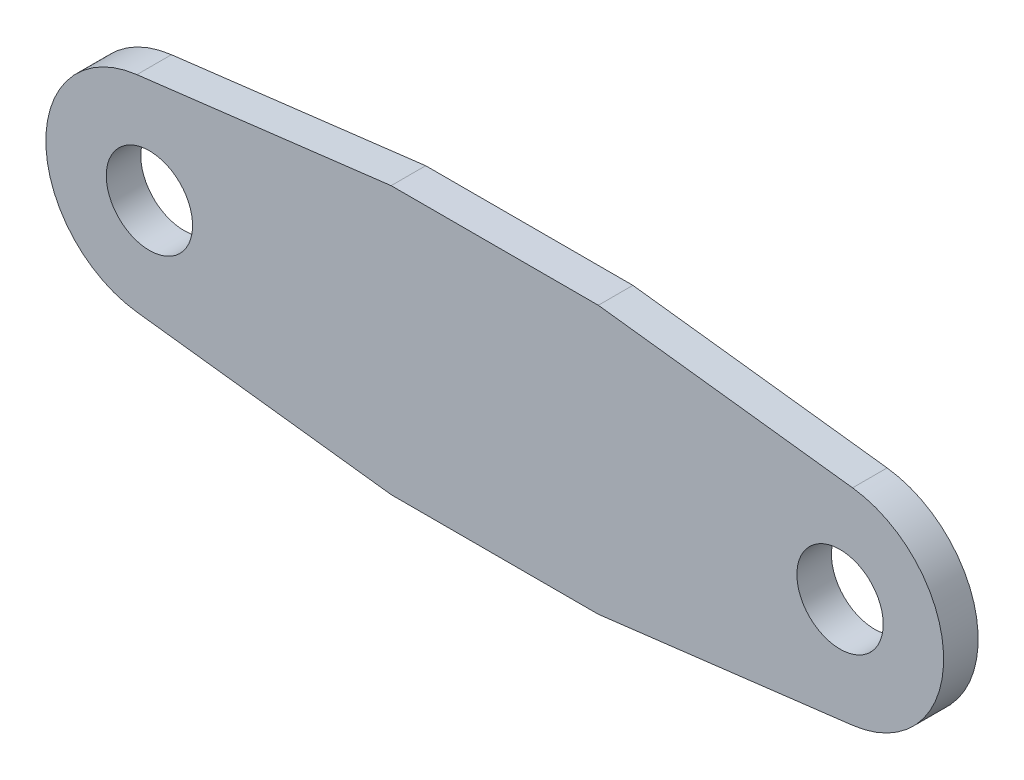
ISO-10303-21;
HEADER;
FILE_DESCRIPTION(('STEP AP214'),'2;1');
FILE_NAME('part.step','',(''),(''),'','','');
FILE_SCHEMA(('AUTOMOTIVE_DESIGN { 1 0 10303 214 1 1 1 1 }'));
ENDSEC;
DATA;
#1=APPLICATION_CONTEXT('core data for automotive mechanical design processes');
#2=APPLICATION_PROTOCOL_DEFINITION('international standard','automotive_design',2000,#1);
#3=PRODUCT_CONTEXT('',#1,'mechanical');
#4=PRODUCT('Part','Part','',(#3));
#5=PRODUCT_RELATED_PRODUCT_CATEGORY('part','',(#4));
#6=PRODUCT_DEFINITION_FORMATION('','',#4);
#7=PRODUCT_DEFINITION_CONTEXT('part definition',#1,'design');
#8=PRODUCT_DEFINITION('design','',#6,#7);
#9=PRODUCT_DEFINITION_SHAPE('','',#8);
#10=(LENGTH_UNIT() NAMED_UNIT(*) SI_UNIT(.MILLI.,.METRE.));
#11=(NAMED_UNIT(*) PLANE_ANGLE_UNIT() SI_UNIT($,.RADIAN.));
#12=(NAMED_UNIT(*) SI_UNIT($,.STERADIAN.) SOLID_ANGLE_UNIT());
#13=UNCERTAINTY_MEASURE_WITH_UNIT(LENGTH_MEASURE(1.E-05),#10,'distance_accuracy_value','');
#14=(GEOMETRIC_REPRESENTATION_CONTEXT(3) GLOBAL_UNCERTAINTY_ASSIGNED_CONTEXT((#13)) GLOBAL_UNIT_ASSIGNED_CONTEXT((#10,
#11,#12)) REPRESENTATION_CONTEXT('',''));
#15=CARTESIAN_POINT('',(0.,0.,0.));
#16=DIRECTION('',(0.,0.,1.));
#17=DIRECTION('',(1.,0.,0.));
#18=AXIS2_PLACEMENT_3D('',#15,#16,#17);
#19=CARTESIAN_POINT('',(9.99999999999999,0.,1.));
#20=DIRECTION('',(0.,0.,1.));
#21=DIRECTION('',(1.,0.,0.));
#22=AXIS2_PLACEMENT_3D('',#19,#20,#21);
#23=PLANE('',#22);
#24=CARTESIAN_POINT('',(9.99999999999999,0.,1.));
#25=DIRECTION('',(0.,0.,1.));
#26=DIRECTION('',(1.,0.,0.));
#27=AXIS2_PLACEMENT_3D('',#24,#25,#26);
#28=CIRCLE('',#27,1.25);
#29=CARTESIAN_POINT('',(11.25,0.,1.));
#30=VERTEX_POINT('',#29);
#31=EDGE_CURVE('E154',#30,#30,#28,.T.);
#32=ORIENTED_EDGE('',*,*,#31,.F.);
#33=EDGE_LOOP('',(#32));
#34=FACE_BOUND('',#33,.T.);
#35=CARTESIAN_POINT('',(9.99999999999999,0.,1.));
#36=DIRECTION('',(0.,0.,1.));
#37=DIRECTION('',(1.,0.,0.));
#38=AXIS2_PLACEMENT_3D('',#35,#36,#37);
#39=CIRCLE('',#38,3.);
#40=CARTESIAN_POINT('',(10.3628106849115,-2.97798059209828,1.));
#41=VERTEX_POINT('',#40);
#42=CARTESIAN_POINT('',(10.3628106849115,2.97798059209828,1.));
#43=VERTEX_POINT('',#42);
#44=EDGE_CURVE('E172',#41,#43,#39,.T.);
#45=ORIENTED_EDGE('',*,*,#44,.T.);
#46=DIRECTION('',(-0.992660197366093,0.120936894970516,0.));
#47=VECTOR('',#46,1.);
#48=CARTESIAN_POINT('',(3.,3.875,1.));
#49=LINE('',#48,#47);
#50=CARTESIAN_POINT('',(3.,3.875,1.));
#51=VERTEX_POINT('',#50);
#52=EDGE_CURVE('E108',#43,#51,#49,.T.);
#53=ORIENTED_EDGE('',*,*,#52,.T.);
#54=DIRECTION('',(-1.,0.,0.));
#55=VECTOR('',#54,1.);
#56=CARTESIAN_POINT('',(-3.00000000000001,3.875,1.));
#57=LINE('',#56,#55);
#58=CARTESIAN_POINT('',(-3.00000000000001,3.875,1.));
#59=VERTEX_POINT('',#58);
#60=EDGE_CURVE('E193',#51,#59,#57,.T.);
#61=ORIENTED_EDGE('',*,*,#60,.T.);
#62=DIRECTION('',(-0.992660197366093,-0.120936894970516,0.));
#63=VECTOR('',#62,1.);
#64=CARTESIAN_POINT('',(-3.00000000000001,3.875,1.));
#65=LINE('',#64,#63);
#66=CARTESIAN_POINT('',(-10.3628106849116,2.97798059209828,1.));
#67=VERTEX_POINT('',#66);
#68=EDGE_CURVE('E207',#59,#67,#65,.T.);
#69=ORIENTED_EDGE('',*,*,#68,.T.);
#70=CARTESIAN_POINT('',(-10.,0.,1.));
#71=DIRECTION('',(0.,0.,1.));
#72=DIRECTION('',(-1.,0.,0.));
#73=AXIS2_PLACEMENT_3D('',#70,#71,#72);
#74=CIRCLE('',#73,3.);
#75=CARTESIAN_POINT('',(-10.3628106849115,-2.97798059209828,1.));
#76=VERTEX_POINT('',#75);
#77=EDGE_CURVE('E127',#67,#76,#74,.T.);
#78=ORIENTED_EDGE('',*,*,#77,.T.);
#79=DIRECTION('',(0.992660197366093,-0.120936894970516,0.));
#80=VECTOR('',#79,1.);
#81=CARTESIAN_POINT('',(-3.00000000000001,-3.875,1.));
#82=LINE('',#81,#80);
#83=CARTESIAN_POINT('',(-3.00000000000001,-3.875,1.));
#84=VERTEX_POINT('',#83);
#85=EDGE_CURVE('E121',#76,#84,#82,.T.);
#86=ORIENTED_EDGE('',*,*,#85,.T.);
#87=DIRECTION('',(1.,0.,0.));
#88=VECTOR('',#87,1.);
#89=CARTESIAN_POINT('',(-3.00000000000001,-3.875,1.));
#90=LINE('',#89,#88);
#91=CARTESIAN_POINT('',(3.,-3.875,1.));
#92=VERTEX_POINT('',#91);
#93=EDGE_CURVE('E125',#84,#92,#90,.T.);
#94=ORIENTED_EDGE('',*,*,#93,.T.);
#95=DIRECTION('',(0.992660197366093,0.120936894970516,0.));
#96=VECTOR('',#95,1.);
#97=CARTESIAN_POINT('',(3.,-3.875,1.));
#98=LINE('',#97,#96);
#99=EDGE_CURVE('E65',#92,#41,#98,.T.);
#100=ORIENTED_EDGE('',*,*,#99,.T.);
#101=EDGE_LOOP('',(#45,#53,#61,#69,#78,#86,#94,#100));
#102=FACE_BOUND('',#101,.T.);
#103=CARTESIAN_POINT('',(-10.,0.,1.));
#104=DIRECTION('',(0.,0.,1.));
#105=DIRECTION('',(-1.,0.,0.));
#106=AXIS2_PLACEMENT_3D('',#103,#104,#105);
#107=CIRCLE('',#106,1.25);
#108=CARTESIAN_POINT('',(-11.25,0.,1.));
#109=VERTEX_POINT('',#108);
#110=EDGE_CURVE('E221',#109,#109,#107,.T.);
#111=ORIENTED_EDGE('',*,*,#110,.F.);
#112=EDGE_LOOP('',(#111));
#113=FACE_BOUND('',#112,.T.);
#114=ADVANCED_FACE('F47',(#34,#102,#113),#23,.T.);
#115=CARTESIAN_POINT('',(9.99999999999999,0.,0.));
#116=DIRECTION('',(0.,0.,1.));
#117=DIRECTION('',(1.,0.,0.));
#118=AXIS2_PLACEMENT_3D('',#115,#116,#117);
#119=PLANE('',#118);
#120=CARTESIAN_POINT('',(9.99999999999999,0.,0.));
#121=DIRECTION('',(0.,0.,1.));
#122=DIRECTION('',(1.,0.,0.));
#123=AXIS2_PLACEMENT_3D('',#120,#121,#122);
#124=CIRCLE('',#123,3.);
#125=CARTESIAN_POINT('',(10.3628106849115,-2.97798059209828,0.));
#126=VERTEX_POINT('',#125);
#127=CARTESIAN_POINT('',(10.3628106849115,2.97798059209828,0.));
#128=VERTEX_POINT('',#127);
#129=EDGE_CURVE('E149',#126,#128,#124,.T.);
#130=ORIENTED_EDGE('',*,*,#129,.F.);
#131=DIRECTION('',(0.992660197366093,0.120936894970516,0.));
#132=VECTOR('',#131,1.);
#133=CARTESIAN_POINT('',(3.,-3.875,0.));
#134=LINE('',#133,#132);
#135=CARTESIAN_POINT('',(3.,-3.875,0.));
#136=VERTEX_POINT('',#135);
#137=EDGE_CURVE('E100',#136,#126,#134,.T.);
#138=ORIENTED_EDGE('',*,*,#137,.F.);
#139=DIRECTION('',(1.,0.,0.));
#140=VECTOR('',#139,1.);
#141=CARTESIAN_POINT('',(-3.00000000000001,-3.875,0.));
#142=LINE('',#141,#140);
#143=CARTESIAN_POINT('',(-3.00000000000001,-3.875,0.));
#144=VERTEX_POINT('',#143);
#145=EDGE_CURVE('E94',#144,#136,#142,.T.);
#146=ORIENTED_EDGE('',*,*,#145,.F.);
#147=DIRECTION('',(0.992660197366093,-0.120936894970516,0.));
#148=VECTOR('',#147,1.);
#149=CARTESIAN_POINT('',(-3.00000000000001,-3.875,0.));
#150=LINE('',#149,#148);
#151=CARTESIAN_POINT('',(-10.3628106849115,-2.97798059209828,0.));
#152=VERTEX_POINT('',#151);
#153=EDGE_CURVE('E136',#152,#144,#150,.T.);
#154=ORIENTED_EDGE('',*,*,#153,.F.);
#155=CARTESIAN_POINT('',(-10.,0.,0.));
#156=DIRECTION('',(0.,0.,1.));
#157=DIRECTION('',(-1.,0.,0.));
#158=AXIS2_PLACEMENT_3D('',#155,#156,#157);
#159=CIRCLE('',#158,3.);
#160=CARTESIAN_POINT('',(-10.3628106849116,2.97798059209828,0.));
#161=VERTEX_POINT('',#160);
#162=EDGE_CURVE('E163',#161,#152,#159,.T.);
#163=ORIENTED_EDGE('',*,*,#162,.F.);
#164=DIRECTION('',(-0.992660197366093,-0.120936894970516,0.));
#165=VECTOR('',#164,1.);
#166=CARTESIAN_POINT('',(-3.00000000000001,3.875,0.));
#167=LINE('',#166,#165);
#168=CARTESIAN_POINT('',(-3.00000000000001,3.875,0.));
#169=VERTEX_POINT('',#168);
#170=EDGE_CURVE('E160',#169,#161,#167,.T.);
#171=ORIENTED_EDGE('',*,*,#170,.F.);
#172=DIRECTION('',(-1.,0.,0.));
#173=VECTOR('',#172,1.);
#174=CARTESIAN_POINT('',(-3.00000000000001,3.875,0.));
#175=LINE('',#174,#173);
#176=CARTESIAN_POINT('',(3.,3.875,0.));
#177=VERTEX_POINT('',#176);
#178=EDGE_CURVE('E157',#177,#169,#175,.T.);
#179=ORIENTED_EDGE('',*,*,#178,.F.);
#180=DIRECTION('',(-0.992660197366093,0.120936894970516,0.));
#181=VECTOR('',#180,1.);
#182=CARTESIAN_POINT('',(3.,3.875,0.));
#183=LINE('',#182,#181);
#184=EDGE_CURVE('E153',#128,#177,#183,.T.);
#185=ORIENTED_EDGE('',*,*,#184,.F.);
#186=EDGE_LOOP('',(#130,#138,#146,#154,#163,#171,#179,#185));
#187=FACE_BOUND('',#186,.T.);
#188=CARTESIAN_POINT('',(9.99999999999999,0.,0.));
#189=DIRECTION('',(0.,0.,1.));
#190=DIRECTION('',(1.,0.,0.));
#191=AXIS2_PLACEMENT_3D('',#188,#189,#190);
#192=CIRCLE('',#191,1.25);
#193=CARTESIAN_POINT('',(11.25,0.,0.));
#194=VERTEX_POINT('',#193);
#195=EDGE_CURVE('E217',#194,#194,#192,.T.);
#196=ORIENTED_EDGE('',*,*,#195,.T.);
#197=EDGE_LOOP('',(#196));
#198=FACE_BOUND('',#197,.T.);
#199=CARTESIAN_POINT('',(-10.,0.,0.));
#200=DIRECTION('',(0.,0.,1.));
#201=DIRECTION('',(-1.,0.,0.));
#202=AXIS2_PLACEMENT_3D('',#199,#200,#201);
#203=CIRCLE('',#202,1.25);
#204=CARTESIAN_POINT('',(-11.25,0.,0.));
#205=VERTEX_POINT('',#204);
#206=EDGE_CURVE('E225',#205,#205,#203,.T.);
#207=ORIENTED_EDGE('',*,*,#206,.T.);
#208=EDGE_LOOP('',(#207));
#209=FACE_BOUND('',#208,.T.);
#210=ADVANCED_FACE('F197',(#187,#198,#209),#119,.F.);
#211=CARTESIAN_POINT('',(9.99999999999999,0.,1.));
#212=DIRECTION('',(0.,0.,-1.));
#213=DIRECTION('',(-1.,0.,0.));
#214=AXIS2_PLACEMENT_3D('',#211,#212,#213);
#215=CYLINDRICAL_SURFACE('',#214,3.);
#216=ORIENTED_EDGE('',*,*,#129,.T.);
#217=DIRECTION('',(0.,0.,-1.));
#218=VECTOR('',#217,1.);
#219=CARTESIAN_POINT('',(10.3628106849115,2.97798059209828,1.));
#220=LINE('',#219,#218);
#221=EDGE_CURVE('E11',#43,#128,#220,.T.);
#222=ORIENTED_EDGE('',*,*,#221,.F.);
#223=ORIENTED_EDGE('',*,*,#44,.F.);
#224=DIRECTION('',(0.,0.,-1.));
#225=VECTOR('',#224,1.);
#226=CARTESIAN_POINT('',(10.3628106849115,-2.97798059209828,1.));
#227=LINE('',#226,#225);
#228=EDGE_CURVE('E145',#41,#126,#227,.T.);
#229=ORIENTED_EDGE('',*,*,#228,.T.);
#230=EDGE_LOOP('',(#216,#222,#223,#229));
#231=FACE_BOUND('',#230,.T.);
#232=ADVANCED_FACE('F49',(#231),#215,.T.);
#233=CARTESIAN_POINT('',(3.,3.875,1.));
#234=DIRECTION('',(-0.120936894970516,-0.992660197366093,0.));
#235=DIRECTION('',(0.992660197366093,-0.120936894970516,0.));
#236=AXIS2_PLACEMENT_3D('',#233,#234,#235);
#237=PLANE('',#236);
#238=ORIENTED_EDGE('',*,*,#184,.T.);
#239=DIRECTION('',(0.,0.,-1.));
#240=VECTOR('',#239,1.);
#241=CARTESIAN_POINT('',(3.,3.875,1.));
#242=LINE('',#241,#240);
#243=EDGE_CURVE('E57',#51,#177,#242,.T.);
#244=ORIENTED_EDGE('',*,*,#243,.F.);
#245=ORIENTED_EDGE('',*,*,#52,.F.);
#246=ORIENTED_EDGE('',*,*,#221,.T.);
#247=EDGE_LOOP('',(#238,#244,#245,#246));
#248=FACE_BOUND('',#247,.T.);
#249=ADVANCED_FACE('F259',(#248),#237,.F.);
#250=CARTESIAN_POINT('',(-3.00000000000001,3.875,1.));
#251=DIRECTION('',(0.,-1.,0.));
#252=DIRECTION('',(0.,0.,-1.));
#253=AXIS2_PLACEMENT_3D('',#250,#251,#252);
#254=PLANE('',#253);
#255=ORIENTED_EDGE('',*,*,#178,.T.);
#256=DIRECTION('',(0.,0.,-1.));
#257=VECTOR('',#256,1.);
#258=CARTESIAN_POINT('',(-3.00000000000001,3.875,1.));
#259=LINE('',#258,#257);
#260=EDGE_CURVE('E183',#59,#169,#259,.T.);
#261=ORIENTED_EDGE('',*,*,#260,.F.);
#262=ORIENTED_EDGE('',*,*,#60,.F.);
#263=ORIENTED_EDGE('',*,*,#243,.T.);
#264=EDGE_LOOP('',(#255,#261,#262,#263));
#265=FACE_BOUND('',#264,.T.);
#266=ADVANCED_FACE('F191',(#265),#254,.F.);
#267=CARTESIAN_POINT('',(-3.00000000000001,3.875,1.));
#268=DIRECTION('',(0.120936894970516,-0.992660197366093,0.));
#269=DIRECTION('',(0.992660197366093,0.120936894970516,0.));
#270=AXIS2_PLACEMENT_3D('',#267,#268,#269);
#271=PLANE('',#270);
#272=ORIENTED_EDGE('',*,*,#170,.T.);
#273=DIRECTION('',(0.,0.,-1.));
#274=VECTOR('',#273,1.);
#275=CARTESIAN_POINT('',(-10.3628106849116,2.97798059209828,1.));
#276=LINE('',#275,#274);
#277=EDGE_CURVE('E179',#67,#161,#276,.T.);
#278=ORIENTED_EDGE('',*,*,#277,.F.);
#279=ORIENTED_EDGE('',*,*,#68,.F.);
#280=ORIENTED_EDGE('',*,*,#260,.T.);
#281=EDGE_LOOP('',(#272,#278,#279,#280));
#282=FACE_BOUND('',#281,.T.);
#283=ADVANCED_FACE('F202',(#282),#271,.F.);
#284=CARTESIAN_POINT('',(-10.,0.,1.));
#285=DIRECTION('',(0.,0.,-1.));
#286=DIRECTION('',(-1.,0.,0.));
#287=AXIS2_PLACEMENT_3D('',#284,#285,#286);
#288=CYLINDRICAL_SURFACE('',#287,3.);
#289=ORIENTED_EDGE('',*,*,#162,.T.);
#290=DIRECTION('',(0.,0.,-1.));
#291=VECTOR('',#290,1.);
#292=CARTESIAN_POINT('',(-10.3628106849115,-2.97798059209828,1.));
#293=LINE('',#292,#291);
#294=EDGE_CURVE('E138',#76,#152,#293,.T.);
#295=ORIENTED_EDGE('',*,*,#294,.F.);
#296=ORIENTED_EDGE('',*,*,#77,.F.);
#297=ORIENTED_EDGE('',*,*,#277,.T.);
#298=EDGE_LOOP('',(#289,#295,#296,#297));
#299=FACE_BOUND('',#298,.T.);
#300=ADVANCED_FACE('F205',(#299),#288,.T.);
#301=CARTESIAN_POINT('',(-3.00000000000001,-3.875,1.));
#302=DIRECTION('',(0.120936894970516,0.992660197366093,0.));
#303=DIRECTION('',(-0.992660197366093,0.120936894970516,0.));
#304=AXIS2_PLACEMENT_3D('',#301,#302,#303);
#305=PLANE('',#304);
#306=ORIENTED_EDGE('',*,*,#153,.T.);
#307=DIRECTION('',(0.,0.,-1.));
#308=VECTOR('',#307,1.);
#309=CARTESIAN_POINT('',(-3.00000000000001,-3.875,1.));
#310=LINE('',#309,#308);
#311=EDGE_CURVE('E133',#84,#144,#310,.T.);
#312=ORIENTED_EDGE('',*,*,#311,.F.);
#313=ORIENTED_EDGE('',*,*,#85,.F.);
#314=ORIENTED_EDGE('',*,*,#294,.T.);
#315=EDGE_LOOP('',(#306,#312,#313,#314));
#316=FACE_BOUND('',#315,.T.);
#317=ADVANCED_FACE('F134',(#316),#305,.F.);
#318=CARTESIAN_POINT('',(-3.00000000000001,-3.875,1.));
#319=DIRECTION('',(0.,1.,0.));
#320=DIRECTION('',(0.,0.,1.));
#321=AXIS2_PLACEMENT_3D('',#318,#319,#320);
#322=PLANE('',#321);
#323=ORIENTED_EDGE('',*,*,#145,.T.);
#324=DIRECTION('',(0.,0.,-1.));
#325=VECTOR('',#324,1.);
#326=CARTESIAN_POINT('',(3.,-3.875,1.));
#327=LINE('',#326,#325);
#328=EDGE_CURVE('E139',#92,#136,#327,.T.);
#329=ORIENTED_EDGE('',*,*,#328,.F.);
#330=ORIENTED_EDGE('',*,*,#93,.F.);
#331=ORIENTED_EDGE('',*,*,#311,.T.);
#332=EDGE_LOOP('',(#323,#329,#330,#331));
#333=FACE_BOUND('',#332,.T.);
#334=ADVANCED_FACE('F141',(#333),#322,.F.);
#335=CARTESIAN_POINT('',(3.,-3.875,1.));
#336=DIRECTION('',(-0.120936894970516,0.992660197366093,0.));
#337=DIRECTION('',(-0.992660197366093,-0.120936894970516,0.));
#338=AXIS2_PLACEMENT_3D('',#335,#336,#337);
#339=PLANE('',#338);
#340=ORIENTED_EDGE('',*,*,#137,.T.);
#341=ORIENTED_EDGE('',*,*,#228,.F.);
#342=ORIENTED_EDGE('',*,*,#99,.F.);
#343=ORIENTED_EDGE('',*,*,#328,.T.);
#344=EDGE_LOOP('',(#340,#341,#342,#343));
#345=FACE_BOUND('',#344,.T.);
#346=ADVANCED_FACE('F247',(#345),#339,.F.);
#347=CARTESIAN_POINT('',(9.99999999999999,0.,1.));
#348=DIRECTION('',(0.,0.,-1.));
#349=DIRECTION('',(-1.,0.,0.));
#350=AXIS2_PLACEMENT_3D('',#347,#348,#349);
#351=CYLINDRICAL_SURFACE('',#350,1.25);
#352=ORIENTED_EDGE('',*,*,#31,.T.);
#353=EDGE_LOOP('',(#352));
#354=FACE_BOUND('',#353,.T.);
#355=ORIENTED_EDGE('',*,*,#195,.F.);
#356=EDGE_LOOP('',(#355));
#357=FACE_BOUND('',#356,.T.);
#358=ADVANCED_FACE('F244',(#354,#357),#351,.F.);
#359=CARTESIAN_POINT('',(-10.,0.,1.));
#360=DIRECTION('',(0.,0.,-1.));
#361=DIRECTION('',(-1.,0.,0.));
#362=AXIS2_PLACEMENT_3D('',#359,#360,#361);
#363=CYLINDRICAL_SURFACE('',#362,1.25);
#364=ORIENTED_EDGE('',*,*,#110,.T.);
#365=EDGE_LOOP('',(#364));
#366=FACE_BOUND('',#365,.T.);
#367=ORIENTED_EDGE('',*,*,#206,.F.);
#368=EDGE_LOOP('',(#367));
#369=FACE_BOUND('',#368,.T.);
#370=ADVANCED_FACE('F233',(#366,#369),#363,.F.);
#371=CLOSED_SHELL('',(#114,#210,#232,#249,#266,#283,#300,#317,#334,#346,#358,#370));
#372=MANIFOLD_SOLID_BREP('B2',#371);
#373=ADVANCED_BREP_SHAPE_REPRESENTATION('',(#18,#372),#14);
#374=SHAPE_DEFINITION_REPRESENTATION(#9,#373);
ENDSEC;
END-ISO-10303-21;
